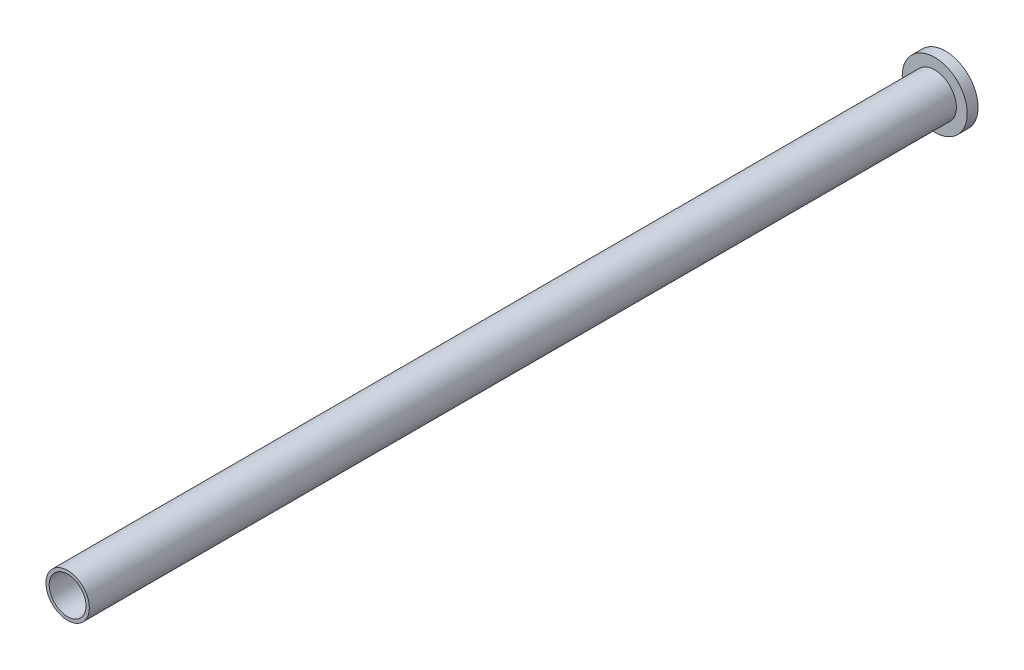
ISO-10303-21;
HEADER;
FILE_DESCRIPTION(('STEP AP214'),'2;1');
FILE_NAME('part.step','',(''),(''),'','','');
FILE_SCHEMA(('AUTOMOTIVE_DESIGN { 1 0 10303 214 1 1 1 1 }'));
ENDSEC;
DATA;
#1=APPLICATION_CONTEXT('core data for automotive mechanical design processes');
#2=APPLICATION_PROTOCOL_DEFINITION('international standard','automotive_design',2000,#1);
#3=PRODUCT_CONTEXT('',#1,'mechanical');
#4=PRODUCT('Part','Part','',(#3));
#5=PRODUCT_RELATED_PRODUCT_CATEGORY('part','',(#4));
#6=PRODUCT_DEFINITION_FORMATION('','',#4);
#7=PRODUCT_DEFINITION_CONTEXT('part definition',#1,'design');
#8=PRODUCT_DEFINITION('design','',#6,#7);
#9=PRODUCT_DEFINITION_SHAPE('','',#8);
#10=(LENGTH_UNIT() NAMED_UNIT(*) SI_UNIT(.MILLI.,.METRE.));
#11=(NAMED_UNIT(*) PLANE_ANGLE_UNIT() SI_UNIT($,.RADIAN.));
#12=(NAMED_UNIT(*) SI_UNIT($,.STERADIAN.) SOLID_ANGLE_UNIT());
#13=UNCERTAINTY_MEASURE_WITH_UNIT(LENGTH_MEASURE(1.E-05),#10,'distance_accuracy_value','');
#14=(GEOMETRIC_REPRESENTATION_CONTEXT(3) GLOBAL_UNCERTAINTY_ASSIGNED_CONTEXT((#13)) GLOBAL_UNIT_ASSIGNED_CONTEXT((#10,
#11,#12)) REPRESENTATION_CONTEXT('',''));
#15=CARTESIAN_POINT('',(0.,0.,0.));
#16=DIRECTION('',(0.,0.,1.));
#17=DIRECTION('',(1.,0.,0.));
#18=AXIS2_PLACEMENT_3D('',#15,#16,#17);
#19=CARTESIAN_POINT('',(0.,0.,400.));
#20=DIRECTION('',(0.,0.,1.));
#21=DIRECTION('',(1.,0.,0.));
#22=AXIS2_PLACEMENT_3D('',#19,#20,#21);
#23=PLANE('',#22);
#24=CARTESIAN_POINT('',(0.,0.,400.));
#25=DIRECTION('',(0.,0.,1.));
#26=DIRECTION('',(1.,0.,0.));
#27=AXIS2_PLACEMENT_3D('',#24,#25,#26);
#28=CIRCLE('',#27,20.);
#29=CARTESIAN_POINT('',(20.,0.,400.));
#30=VERTEX_POINT('',#29);
#31=EDGE_CURVE('E10',#30,#30,#28,.T.);
#32=ORIENTED_EDGE('',*,*,#31,.T.);
#33=EDGE_LOOP('',(#32));
#34=FACE_BOUND('',#33,.T.);
#35=CARTESIAN_POINT('',(0.,0.,400.));
#36=DIRECTION('',(0.,0.,1.));
#37=DIRECTION('',(1.,0.,0.));
#38=AXIS2_PLACEMENT_3D('',#35,#36,#37);
#39=CIRCLE('',#38,17.);
#40=CARTESIAN_POINT('',(17.,0.,400.));
#41=VERTEX_POINT('',#40);
#42=EDGE_CURVE('E51',#41,#41,#39,.T.);
#43=ORIENTED_EDGE('',*,*,#42,.F.);
#44=EDGE_LOOP('',(#43));
#45=FACE_BOUND('',#44,.T.);
#46=ADVANCED_FACE('F43',(#34,#45),#23,.T.);
#47=CARTESIAN_POINT('',(0.,0.,400.));
#48=DIRECTION('',(0.,0.,-1.));
#49=DIRECTION('',(-1.,0.,0.));
#50=AXIS2_PLACEMENT_3D('',#47,#48,#49);
#51=CYLINDRICAL_SURFACE('',#50,20.);
#52=ORIENTED_EDGE('',*,*,#31,.F.);
#53=EDGE_LOOP('',(#52));
#54=FACE_BOUND('',#53,.T.);
#55=CARTESIAN_POINT('',(0.,0.,-400.));
#56=DIRECTION('',(0.,0.,1.));
#57=DIRECTION('',(1.,0.,0.));
#58=AXIS2_PLACEMENT_3D('',#55,#56,#57);
#59=CIRCLE('',#58,20.);
#60=CARTESIAN_POINT('',(20.,0.,-400.));
#61=VERTEX_POINT('',#60);
#62=EDGE_CURVE('E61',#61,#61,#59,.T.);
#63=ORIENTED_EDGE('',*,*,#62,.T.);
#64=EDGE_LOOP('',(#63));
#65=FACE_BOUND('',#64,.T.);
#66=ADVANCED_FACE('F45',(#54,#65),#51,.T.);
#67=CARTESIAN_POINT('',(0.,0.,400.));
#68=DIRECTION('',(0.,0.,-1.));
#69=DIRECTION('',(-1.,0.,0.));
#70=AXIS2_PLACEMENT_3D('',#67,#68,#69);
#71=CYLINDRICAL_SURFACE('',#70,17.);
#72=ORIENTED_EDGE('',*,*,#42,.T.);
#73=EDGE_LOOP('',(#72));
#74=FACE_BOUND('',#73,.T.);
#75=CARTESIAN_POINT('',(0.,0.,-400.));
#76=DIRECTION('',(0.,0.,1.));
#77=DIRECTION('',(1.,0.,0.));
#78=AXIS2_PLACEMENT_3D('',#75,#76,#77);
#79=CIRCLE('',#78,17.);
#80=CARTESIAN_POINT('',(17.,0.,-400.));
#81=VERTEX_POINT('',#80);
#82=EDGE_CURVE('E56',#81,#81,#79,.T.);
#83=ORIENTED_EDGE('',*,*,#82,.F.);
#84=EDGE_LOOP('',(#83));
#85=FACE_BOUND('',#84,.T.);
#86=ADVANCED_FACE('F87',(#74,#85),#71,.F.);
#87=CARTESIAN_POINT('',(0.,0.,-400.));
#88=DIRECTION('',(0.,0.,-1.));
#89=DIRECTION('',(-1.,0.,0.));
#90=AXIS2_PLACEMENT_3D('',#87,#88,#89);
#91=PLANE('',#90);
#92=ORIENTED_EDGE('',*,*,#62,.F.);
#93=EDGE_LOOP('',(#92));
#94=FACE_BOUND('',#93,.T.);
#95=CARTESIAN_POINT('',(0.,0.,-400.));
#96=DIRECTION('',(0.,0.,-1.));
#97=DIRECTION('',(-1.,0.,0.));
#98=AXIS2_PLACEMENT_3D('',#95,#96,#97);
#99=CIRCLE('',#98,30.);
#100=CARTESIAN_POINT('',(-30.,0.,-400.));
#101=VERTEX_POINT('',#100);
#102=EDGE_CURVE('E68',#101,#101,#99,.T.);
#103=ORIENTED_EDGE('',*,*,#102,.F.);
#104=EDGE_LOOP('',(#103));
#105=FACE_BOUND('',#104,.T.);
#106=ADVANCED_FACE('F85',(#94,#105),#91,.F.);
#107=CARTESIAN_POINT('',(0.,0.,-410.));
#108=DIRECTION('',(0.,0.,-1.));
#109=DIRECTION('',(-1.,0.,0.));
#110=AXIS2_PLACEMENT_3D('',#107,#108,#109);
#111=PLANE('',#110);
#112=CARTESIAN_POINT('',(0.,0.,-410.));
#113=DIRECTION('',(0.,0.,-1.));
#114=DIRECTION('',(-1.,0.,0.));
#115=AXIS2_PLACEMENT_3D('',#112,#113,#114);
#116=CIRCLE('',#115,30.);
#117=CARTESIAN_POINT('',(-30.,0.,-410.));
#118=VERTEX_POINT('',#117);
#119=EDGE_CURVE('E66',#118,#118,#116,.T.);
#120=ORIENTED_EDGE('',*,*,#119,.T.);
#121=EDGE_LOOP('',(#120));
#122=FACE_BOUND('',#121,.T.);
#123=ADVANCED_FACE('F76',(#122),#111,.T.);
#124=CARTESIAN_POINT('',(0.,0.,-410.));
#125=DIRECTION('',(0.,0.,1.));
#126=DIRECTION('',(1.,0.,0.));
#127=AXIS2_PLACEMENT_3D('',#124,#125,#126);
#128=CYLINDRICAL_SURFACE('',#127,30.);
#129=ORIENTED_EDGE('',*,*,#119,.F.);
#130=EDGE_LOOP('',(#129));
#131=FACE_BOUND('',#130,.T.);
#132=ORIENTED_EDGE('',*,*,#102,.T.);
#133=EDGE_LOOP('',(#132));
#134=FACE_BOUND('',#133,.T.);
#135=ADVANCED_FACE('F78',(#131,#134),#128,.T.);
#136=ORIENTED_EDGE('',*,*,#82,.T.);
#137=EDGE_LOOP('',(#136));
#138=FACE_BOUND('',#137,.T.);
#139=ADVANCED_FACE('F81',(#138),#91,.F.);
#140=CLOSED_SHELL('',(#46,#66,#86,#106,#123,#135,#139));
#141=MANIFOLD_SOLID_BREP('B2',#140);
#142=ADVANCED_BREP_SHAPE_REPRESENTATION('',(#18,#141),#14);
#143=SHAPE_DEFINITION_REPRESENTATION(#9,#142);
ENDSEC;
END-ISO-10303-21;
